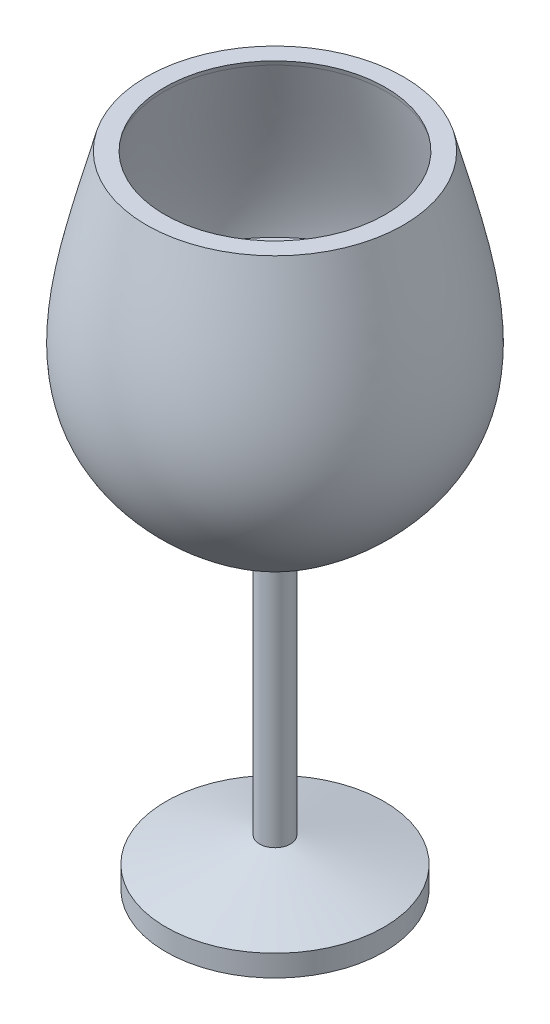
ISO-10303-21;
HEADER;
FILE_DESCRIPTION(('STEP AP214'),'2;1');
FILE_NAME('part.step','',(''),(''),'','','');
FILE_SCHEMA(('AUTOMOTIVE_DESIGN { 1 0 10303 214 1 1 1 1 }'));
ENDSEC;
DATA;
#1=APPLICATION_CONTEXT('core data for automotive mechanical design processes');
#2=APPLICATION_PROTOCOL_DEFINITION('international standard','automotive_design',2000,#1);
#3=PRODUCT_CONTEXT('',#1,'mechanical');
#4=PRODUCT('Part','Part','',(#3));
#5=PRODUCT_RELATED_PRODUCT_CATEGORY('part','',(#4));
#6=PRODUCT_DEFINITION_FORMATION('','',#4);
#7=PRODUCT_DEFINITION_CONTEXT('part definition',#1,'design');
#8=PRODUCT_DEFINITION('design','',#6,#7);
#9=PRODUCT_DEFINITION_SHAPE('','',#8);
#10=(LENGTH_UNIT() NAMED_UNIT(*) SI_UNIT(.MILLI.,.METRE.));
#11=(NAMED_UNIT(*) PLANE_ANGLE_UNIT() SI_UNIT($,.RADIAN.));
#12=(NAMED_UNIT(*) SI_UNIT($,.STERADIAN.) SOLID_ANGLE_UNIT());
#13=UNCERTAINTY_MEASURE_WITH_UNIT(LENGTH_MEASURE(1.E-05),#10,'distance_accuracy_value','');
#14=(GEOMETRIC_REPRESENTATION_CONTEXT(3) GLOBAL_UNCERTAINTY_ASSIGNED_CONTEXT((#13)) GLOBAL_UNIT_ASSIGNED_CONTEXT((#10,
#11,#12)) REPRESENTATION_CONTEXT('',''));
#15=CARTESIAN_POINT('',(0.,0.,0.));
#16=DIRECTION('',(0.,0.,1.));
#17=DIRECTION('',(1.,0.,0.));
#18=AXIS2_PLACEMENT_3D('',#15,#16,#17);
#19=CARTESIAN_POINT('',(18.0204745204967,9.7380344340659,0.));
#20=CARTESIAN_POINT('',(13.2322713075339,4.62684453920163,0.));
#21=CARTESIAN_POINT('',(6.78649593657619,2.17173837301164,0.));
#22=CARTESIAN_POINT('',(0.,2.1717398389887,0.));
#23=B_SPLINE_CURVE_WITH_KNOTS('',3,(#19,#20,#21,#22),.UNSPECIFIED.,.F.,.F.,(4,4),(0.,1.),.UNSPECIFIED.);
#24=CARTESIAN_POINT('',(0.,24.4330712107274,0.));
#25=DIRECTION('',(0.,1.,0.));
#26=AXIS1_PLACEMENT('',#24,#25);
#27=SURFACE_OF_REVOLUTION('',#23,#26);
#28=CARTESIAN_POINT('',(0.,2.17173983898873,0.));
#29=VERTEX_POINT('',#28);
#30=VERTEX_LOOP('',#29);
#31=FACE_BOUND('',#30,.T.);
#32=CARTESIAN_POINT('',(0.,9.73803443406594,0.));
#33=DIRECTION('',(0.,1.,0.));
#34=DIRECTION('',(-1.,0.,0.));
#35=AXIS2_PLACEMENT_3D('',#32,#33,#34);
#36=CIRCLE('',#35,18.0204745204966);
#37=CARTESIAN_POINT('',(-18.0204745204965,9.73803443406597,0.));
#38=VERTEX_POINT('',#37);
#39=EDGE_CURVE('E12',#38,#38,#36,.T.);
#40=ORIENTED_EDGE('',*,*,#39,.F.);
#41=EDGE_LOOP('',(#40));
#42=FACE_BOUND('',#41,.T.);
#43=ADVANCED_FACE('F49',(#31,#42),#27,.F.);
#44=CARTESIAN_POINT('',(18.0204745204966,9.7380344340659,0.));
#45=CARTESIAN_POINT('',(18.4900685089358,10.239614320576,0.));
#46=CARTESIAN_POINT('',(19.4924558868256,11.3813893940339,0.));
#47=CARTESIAN_POINT('',(21.9691341755332,14.7112040778336,0.));
#48=CARTESIAN_POINT('',(24.3918502599429,20.2138998027823,0.));
#49=CARTESIAN_POINT('',(24.772115373663,28.2858788496949,0.));
#50=CARTESIAN_POINT('',(23.4228134455826,36.6928847973291,0.));
#51=CARTESIAN_POINT('',(21.3279127638743,45.1712420028273,0.));
#52=CARTESIAN_POINT('',(19.7768163109431,50.8992505758036,0.));
#53=CARTESIAN_POINT('',(19.018524325718,53.7532378800779,0.));
#54=B_SPLINE_CURVE_WITH_KNOTS('',3,(#44,#45,#46,#47,#48,#49,#50,#51,#52,#53),.UNSPECIFIED.,.F.,
.F.,(4,1,1,1,1,1,1,4),(0.,0.0455936969122257,0.101438668485243,0.281150934788194,
0.460863201091146,0.640575467394097,0.820287733697049,1.),.UNSPECIFIED.);
#55=CARTESIAN_POINT('',(0.,24.4330712107274,0.));
#56=DIRECTION('',(0.,1.,0.));
#57=AXIS1_PLACEMENT('',#55,#56);
#58=SURFACE_OF_REVOLUTION('',#54,#57);
#59=CARTESIAN_POINT('',(0.,24.4330712107275,0.));
#60=DIRECTION('',(0.,1.,0.));
#61=DIRECTION('',(-1.,0.,0.));
#62=AXIS2_PLACEMENT_3D('',#59,#60,#61);
#63=CIRCLE('',#62,24.4979032601242);
#64=CARTESIAN_POINT('',(-24.4979032601241,24.4330712107275,0.));
#65=VERTEX_POINT('',#64);
#66=EDGE_CURVE('E56',#65,#65,#63,.T.);
#67=ORIENTED_EDGE('',*,*,#66,.F.);
#68=EDGE_LOOP('',(#67));
#69=FACE_BOUND('',#68,.T.);
#70=ORIENTED_EDGE('',*,*,#39,.T.);
#71=EDGE_LOOP('',(#70));
#72=FACE_BOUND('',#71,.T.);
#73=ADVANCED_FACE('F61',(#69,#72),#58,.T.);
#74=CARTESIAN_POINT('',(0.,24.4330712107274,0.));
#75=DIRECTION('',(0.,1.,0.));
#76=DIRECTION('',(-1.,0.,0.));
#77=AXIS2_PLACEMENT_3D('',#74,#75,#76);
#78=PLANE('',#77);
#79=ORIENTED_EDGE('',*,*,#66,.T.);
#80=EDGE_LOOP('',(#79));
#81=FACE_BOUND('',#80,.T.);
#82=ADVANCED_FACE('F65',(#81),#78,.T.);
#83=CLOSED_SHELL('',(#43,#73,#82));
#84=MANIFOLD_SOLID_BREP('B2_NOT_SHOWN',#83);
#85=CARTESIAN_POINT('',(0.,54.5235970310579,0.));
#86=DIRECTION('',(0.,1.,0.));
#87=DIRECTION('',(-1.,0.,0.));
#88=AXIS2_PLACEMENT_3D('',#85,#86,#87);
#89=PLANE('',#88);
#90=CARTESIAN_POINT('',(0.,54.5235970310579,0.));
#91=DIRECTION('',(0.,-1.,0.));
#92=DIRECTION('',(1.,0.,0.));
#93=AXIS2_PLACEMENT_3D('',#90,#91,#92);
#94=CIRCLE('',#93,18.8138432575654);
#95=CARTESIAN_POINT('',(18.8138432575654,54.5235970310579,0.));
#96=VERTEX_POINT('',#95);
#97=EDGE_CURVE('E132',#96,#96,#94,.T.);
#98=ORIENTED_EDGE('',*,*,#97,.T.);
#99=EDGE_LOOP('',(#98));
#100=FACE_BOUND('',#99,.T.);
#101=CARTESIAN_POINT('',(0.,54.5235970310579,0.));
#102=DIRECTION('',(0.,-1.,0.));
#103=DIRECTION('',(1.,0.,0.));
#104=AXIS2_PLACEMENT_3D('',#101,#102,#103);
#105=CIRCLE('',#104,21.917928881571);
#106=CARTESIAN_POINT('',(21.917928881571,54.5235970310579,0.));
#107=VERTEX_POINT('',#106);
#108=EDGE_CURVE('E112',#107,#107,#105,.T.);
#109=ORIENTED_EDGE('',*,*,#108,.F.);
#110=EDGE_LOOP('',(#109));
#111=FACE_BOUND('',#110,.T.);
#112=ADVANCED_FACE('F105',(#100,#111),#89,.T.);
#113=CARTESIAN_POINT('',(2.63125382269372,-4.73625688084869,0.));
#114=CARTESIAN_POINT('',(34.4711174987146,12.0189705292343,0.));
#115=CARTESIAN_POINT('',(29.4430535157966,26.1937160551501,0.));
#116=CARTESIAN_POINT('',(21.917928881571,54.5235970310579,0.));
#117=B_SPLINE_CURVE_WITH_KNOTS('',3,(#113,#114,#115,#116),.UNSPECIFIED.,.F.,.F.,(4,4),(0.,1.),.UNSPECIFIED.);
#118=CARTESIAN_POINT('',(0.,-54.5235970310579,0.));
#119=DIRECTION('',(0.,-1.,0.));
#120=AXIS1_PLACEMENT('',#118,#119);
#121=SURFACE_OF_REVOLUTION('',#117,#120);
#122=ORIENTED_EDGE('',*,*,#108,.T.);
#123=EDGE_LOOP('',(#122));
#124=FACE_BOUND('',#123,.T.);
#125=CARTESIAN_POINT('',(0.,-4.73625688084869,0.));
#126=DIRECTION('',(0.,-1.,0.));
#127=DIRECTION('',(1.,0.,0.));
#128=AXIS2_PLACEMENT_3D('',#125,#126,#127);
#129=CIRCLE('',#128,2.63125382269371);
#130=CARTESIAN_POINT('',(2.63125382269372,-4.73625688084869,0.));
#131=VERTEX_POINT('',#130);
#132=EDGE_CURVE('E47',#131,#131,#129,.T.);
#133=ORIENTED_EDGE('',*,*,#132,.F.);
#134=EDGE_LOOP('',(#133));
#135=FACE_BOUND('',#134,.T.);
#136=ADVANCED_FACE('F143',(#124,#135),#121,.F.);
#137=CARTESIAN_POINT('',(0.,-50.8616839762071,0.));
#138=DIRECTION('',(0.,-1.,0.));
#139=DIRECTION('',(1.,0.,0.));
#140=AXIS2_PLACEMENT_3D('',#137,#138,#139);
#141=CONICAL_SURFACE('',#140,18.5948712159354,1.30772398914342);
#142=CARTESIAN_POINT('',(0.,-46.562458286038,0.));
#143=DIRECTION('',(0.,-1.,0.));
#144=DIRECTION('',(1.,0.,0.));
#145=AXIS2_PLACEMENT_3D('',#142,#143,#144);
#146=CIRCLE('',#145,2.6312538226937);
#147=CARTESIAN_POINT('',(2.63125382269371,-46.562458286038,0.));
#148=VERTEX_POINT('',#147);
#149=EDGE_CURVE('E125',#148,#148,#146,.T.);
#150=CARTESIAN_POINT('',(0.,-50.8616839762071,0.));
#151=DIRECTION('',(0.,-1.,0.));
#152=DIRECTION('',(1.,0.,0.));
#153=AXIS2_PLACEMENT_3D('',#150,#151,#152);
#154=CIRCLE('',#153,18.5948712159354);
#155=CARTESIAN_POINT('',(18.5948712159354,-50.8616839762071,0.));
#156=VERTEX_POINT('',#155);
#157=EDGE_CURVE('E129',#156,#156,#154,.T.);
#158=CARTESIAN_POINT('',(2.63125382269371,-46.562458286038,0.));
#159=CARTESIAN_POINT('',(2.79754150387332,-46.6072418869773,0.));
#160=CARTESIAN_POINT('',(2.96382918505292,-46.6520254879166,0.));
#161=CARTESIAN_POINT('',(3.29640454741212,-46.7415926897951,0.));
#162=CARTESIAN_POINT('',(3.46269222859172,-46.7863762907343,0.));
#163=CARTESIAN_POINT('',(3.79526759095092,-46.8759434926129,0.));
#164=CARTESIAN_POINT('',(3.96155527213052,-46.9207270935521,0.));
#165=CARTESIAN_POINT('',(4.29413063448972,-47.0102942954306,0.));
#166=CARTESIAN_POINT('',(4.46041831566932,-47.0550778963699,0.));
#167=CARTESIAN_POINT('',(4.79299367802853,-47.1446450982484,0.));
#168=CARTESIAN_POINT('',(4.95928135920813,-47.1894286991877,0.));
#169=CARTESIAN_POINT('',(5.29185672156733,-47.2789959010662,0.));
#170=CARTESIAN_POINT('',(5.45814440274693,-47.3237795020055,0.));
#171=CARTESIAN_POINT('',(5.79071976510613,-47.413346703884,0.));
#172=CARTESIAN_POINT('',(5.95700744628573,-47.4581303048232,0.));
#173=CARTESIAN_POINT('',(6.28958280864494,-47.5476975067018,0.));
#174=CARTESIAN_POINT('',(6.45587048982453,-47.592481107641,0.));
#175=CARTESIAN_POINT('',(6.78844585218374,-47.6820483095196,0.));
#176=CARTESIAN_POINT('',(6.95473353336334,-47.7268319104588,0.));
#177=CARTESIAN_POINT('',(7.28730889572254,-47.8163991123373,0.));
#178=CARTESIAN_POINT('',(7.45359657690214,-47.8611827132766,0.));
#179=CARTESIAN_POINT('',(7.78617193926134,-47.9507499151551,0.));
#180=CARTESIAN_POINT('',(7.95245962044095,-47.9955335160944,0.));
#181=CARTESIAN_POINT('',(8.28503498280015,-48.0851007179729,0.));
#182=CARTESIAN_POINT('',(8.45132266397975,-48.1298843189122,0.));
#183=CARTESIAN_POINT('',(8.78389802633895,-48.2194515207907,0.));
#184=CARTESIAN_POINT('',(8.95018570751855,-48.2642351217299,0.));
#185=CARTESIAN_POINT('',(9.28276106987775,-48.3538023236085,0.));
#186=CARTESIAN_POINT('',(9.44904875105735,-48.3985859245477,0.));
#187=CARTESIAN_POINT('',(9.78162411341656,-48.4881531264263,0.));
#188=CARTESIAN_POINT('',(9.94791179459616,-48.5329367273655,0.));
#189=CARTESIAN_POINT('',(10.2804871569554,-48.622503929244,0.));
#190=CARTESIAN_POINT('',(10.446774838135,-48.6672875301833,0.));
#191=CARTESIAN_POINT('',(10.7793502004942,-48.7568547320618,0.));
#192=CARTESIAN_POINT('',(10.9456378816738,-48.8016383330011,0.));
#193=CARTESIAN_POINT('',(11.278213244033,-48.8912055348796,0.));
#194=CARTESIAN_POINT('',(11.4445009252126,-48.9359891358189,0.));
#195=CARTESIAN_POINT('',(11.7770762875718,-49.0255563376974,0.));
#196=CARTESIAN_POINT('',(11.9433639687514,-49.0703399386366,0.));
#197=CARTESIAN_POINT('',(12.2759393311106,-49.1599071405152,0.));
#198=CARTESIAN_POINT('',(12.4422270122902,-49.2046907414544,0.));
#199=CARTESIAN_POINT('',(12.7748023746494,-49.294257943333,0.));
#200=CARTESIAN_POINT('',(12.941090055829,-49.3390415442722,0.));
#201=CARTESIAN_POINT('',(13.2736654181882,-49.4286087461507,0.));
#202=CARTESIAN_POINT('',(13.4399530993678,-49.47339234709,0.));
#203=CARTESIAN_POINT('',(13.772528461727,-49.5629595489685,0.));
#204=CARTESIAN_POINT('',(13.9388161429066,-49.6077431499078,0.));
#205=CARTESIAN_POINT('',(14.2713915052658,-49.6973103517863,0.));
#206=CARTESIAN_POINT('',(14.4376791864454,-49.7420939527256,0.));
#207=CARTESIAN_POINT('',(14.7702545488046,-49.8316611546041,0.));
#208=CARTESIAN_POINT('',(14.9365422299842,-49.8764447555433,0.));
#209=CARTESIAN_POINT('',(15.2691175923434,-49.9660119574219,0.));
#210=CARTESIAN_POINT('',(15.435405273523,-50.0107955583611,0.));
#211=CARTESIAN_POINT('',(15.7679806358822,-50.1003627602397,0.));
#212=CARTESIAN_POINT('',(15.9342683170618,-50.1451463611789,0.));
#213=CARTESIAN_POINT('',(16.266843679421,-50.2347135630574,0.));
#214=CARTESIAN_POINT('',(16.4331313606006,-50.2794971639967,0.));
#215=CARTESIAN_POINT('',(16.7657067229598,-50.3690643658752,0.));
#216=CARTESIAN_POINT('',(16.9319944041394,-50.4138479668145,0.));
#217=CARTESIAN_POINT('',(17.2645697664986,-50.503415168693,0.));
#218=CARTESIAN_POINT('',(17.4308574476782,-50.5481987696323,0.));
#219=CARTESIAN_POINT('',(17.7634328100374,-50.6377659715108,0.));
#220=CARTESIAN_POINT('',(17.929720491217,-50.68254957245,0.));
#221=CARTESIAN_POINT('',(18.2622958535762,-50.7721167743286,0.));
#222=CARTESIAN_POINT('',(18.4285835347558,-50.8169003752678,0.));
#223=CARTESIAN_POINT('',(18.5948712159354,-50.8616839762071,0.));
#224=B_SPLINE_CURVE_WITH_KNOTS('',3,(#158,#159,#160,#161,#162,#163,#164,#165,#166,#167,#168,
#169,#170,#171,#172,#173,#174,#175,#176,#177,#178,#179,#180,#181,#182,#183,#184,#185,#186,#187,
#188,#189,#190,#191,#192,#193,#194,#195,#196,#197,#198,#199,#200,#201,#202,#203,#204,#205,#206,
#207,#208,#209,#210,#211,#212,#213,#214,#215,#216,#217,#218,#219,#220,#221,#222,#223),
.UNSPECIFIED.,.F.,.F.,(4,2,2,2,2,2,2,2,2,2,2,2,2,2,2,2,2,2,2,2,2,2,2,2,2,2,2,2,2,2,2,2,4),(0.,
0.516637662609474,1.03327532521895,1.54991298782842,2.0665506504379,2.58318831304737,
3.09982597565684,3.61646363826631,4.13310130087579,4.64973896348526,5.16637662609474,
5.68301428870421,6.19965195131368,6.71628961392316,7.23292727653263,7.7495649391421,
8.26620260175158,8.78284026436105,9.29947792697053,9.81611558958,10.3327532521895,
10.8493909147989,11.3660285774084,11.8826662400179,12.3993039026274,12.9159415652368,
13.4325792278463,13.9492168904558,14.4658545530653,14.9824922156747,15.4991298782842,
16.0157675408937,16.5324052035032),.UNSPECIFIED.);
#225=EDGE_CURVE('BSEAM146',#148,#156,#224,.T.);
#226=ORIENTED_EDGE('',*,*,#149,.T.);
#227=ORIENTED_EDGE('',*,*,#157,.F.);
#228=ORIENTED_EDGE('',*,*,#225,.T.);
#229=ORIENTED_EDGE('',*,*,#225,.F.);
#230=EDGE_LOOP('',(#226,#228,#227,#229));
#231=FACE_BOUND('',#230,.T.);
#232=ADVANCED_FACE('F146',(#231),#141,.T.);
#233=CARTESIAN_POINT('',(0.,-54.5235970310579,0.));
#234=DIRECTION('',(0.,-1.,0.));
#235=DIRECTION('',(1.,0.,0.));
#236=AXIS2_PLACEMENT_3D('',#233,#234,#235);
#237=CYLINDRICAL_SURFACE('',#236,18.5948712159354);
#238=ORIENTED_EDGE('',*,*,#157,.T.);
#239=EDGE_LOOP('',(#238));
#240=FACE_BOUND('',#239,.T.);
#241=CARTESIAN_POINT('',(0.,-54.5235970310579,0.));
#242=DIRECTION('',(0.,-1.,0.));
#243=DIRECTION('',(1.,0.,0.));
#244=AXIS2_PLACEMENT_3D('',#241,#242,#243);
#245=CIRCLE('',#244,18.5948712159354);
#246=CARTESIAN_POINT('',(18.5948712159354,-54.5235970310579,0.));
#247=VERTEX_POINT('',#246);
#248=EDGE_CURVE('E269',#247,#247,#245,.T.);
#249=ORIENTED_EDGE('',*,*,#248,.F.);
#250=EDGE_LOOP('',(#249));
#251=FACE_BOUND('',#250,.T.);
#252=ADVANCED_FACE('F154',(#240,#251),#237,.T.);
#253=CARTESIAN_POINT('',(0.,-54.5235970310579,0.));
#254=DIRECTION('',(0.,-1.,0.));
#255=DIRECTION('',(1.,0.,0.));
#256=AXIS2_PLACEMENT_3D('',#253,#254,#255);
#257=CYLINDRICAL_SURFACE('',#256,2.6312538226937);
#258=ORIENTED_EDGE('',*,*,#132,.T.);
#259=EDGE_LOOP('',(#258));
#260=FACE_BOUND('',#259,.T.);
#261=ORIENTED_EDGE('',*,*,#149,.F.);
#262=EDGE_LOOP('',(#261));
#263=FACE_BOUND('',#262,.T.);
#264=ADVANCED_FACE('F107',(#260,#263),#257,.T.);
#265=CARTESIAN_POINT('',(0.,-54.5235970310579,0.));
#266=DIRECTION('',(0.,-1.,0.));
#267=DIRECTION('',(1.,0.,0.));
#268=AXIS2_PLACEMENT_3D('',#265,#266,#267);
#269=PLANE('',#268);
#270=ORIENTED_EDGE('',*,*,#248,.T.);
#271=EDGE_LOOP('',(#270));
#272=FACE_BOUND('',#271,.T.);
#273=ADVANCED_FACE('F119',(#272),#269,.T.);
#274=CARTESIAN_POINT('',(18.0410293841508,9.76000981858693,0.));
#275=CARTESIAN_POINT('',(13.2507279935608,4.63388304850354,0.));
#276=CARTESIAN_POINT('',(6.7962127503958,2.17173983898877,0.));
#277=CARTESIAN_POINT('',(0.,2.17173983898872,0.));
#278=B_SPLINE_CURVE_WITH_KNOTS('',3,(#274,#275,#276,#277),.UNSPECIFIED.,.F.,.F.,(4,4),(0.,1.),.UNSPECIFIED.);
#279=CARTESIAN_POINT('',(0.,-2.08195019282968,0.));
#280=DIRECTION('',(0.,-1.,0.));
#281=AXIS1_PLACEMENT('',#279,#280);
#282=SURFACE_OF_REVOLUTION('',#278,#281);
#283=CARTESIAN_POINT('',(0.,2.17173983898872,0.));
#284=VERTEX_POINT('',#283);
#285=VERTEX_LOOP('',#284);
#286=FACE_BOUND('',#285,.T.);
#287=CARTESIAN_POINT('',(0.,9.7380344340659,0.));
#288=DIRECTION('',(0.,-1.,0.));
#289=DIRECTION('',(1.,0.,0.));
#290=AXIS2_PLACEMENT_3D('',#287,#288,#289);
#291=CIRCLE('',#290,18.0204745204966);
#292=CARTESIAN_POINT('',(18.0204745204966,9.7380344340659,0.));
#293=VERTEX_POINT('',#292);
#294=EDGE_CURVE('E123',#293,#293,#291,.T.);
#295=ORIENTED_EDGE('',*,*,#294,.F.);
#296=EDGE_LOOP('',(#295));
#297=FACE_BOUND('',#296,.T.);
#298=ADVANCED_FACE('F115',(#286,#297),#282,.F.);
#299=CARTESIAN_POINT('',(1.23316369472001,-2.08195019282968,0.));
#300=CARTESIAN_POINT('',(2.50865179455628,-1.41011851310019,0.));
#301=CARTESIAN_POINT('',(5.04504117979889,-0.0211804316823236,0.));
#302=CARTESIAN_POINT('',(9.79053170164773,2.85311600755581,0.));
#303=CARTESIAN_POINT('',(13.6686429512201,5.64158783760901,0.));
#304=CARTESIAN_POINT('',(17.1295804941064,8.76036442411872,0.));
#305=CARTESIAN_POINT('',(19.1025449839092,10.8571666656221,0.));
#306=CARTESIAN_POINT('',(21.9691341755332,14.7112040778336,0.));
#307=CARTESIAN_POINT('',(24.3918502599429,20.2138998027823,0.));
#308=CARTESIAN_POINT('',(24.772115373663,28.2858788496949,0.));
#309=CARTESIAN_POINT('',(23.4228134455826,36.6928847973291,0.));
#310=CARTESIAN_POINT('',(21.3279127638743,45.1712420028273,0.));
#311=CARTESIAN_POINT('',(19.7768163109431,50.8992505758036,0.));
#312=CARTESIAN_POINT('',(19.018524325718,53.7532378800779,0.));
#313=B_SPLINE_CURVE_WITH_KNOTS('',3,(#299,#300,#301,#302,#303,#304,#305,#306,#307,#308,#309,
#310,#311,#312),.UNSPECIFIED.,.F.,.F.,(4,1,1,1,1,1,1,1,1,1,1,4),(0.,0.0625,0.125,
0.242406677892763,0.273656677892763,0.336156677892763,0.375,0.5,0.625,0.75,0.875,1.),.UNSPECIFIED.);
#314=CARTESIAN_POINT('',(0.,-2.08195019282968,0.));
#315=DIRECTION('',(0.,-1.,0.));
#316=AXIS1_PLACEMENT('',#314,#315);
#317=SURFACE_OF_REVOLUTION('',#313,#316);
#318=CARTESIAN_POINT('',(0.,53.7532378800779,0.));
#319=DIRECTION('',(0.,-1.,0.));
#320=DIRECTION('',(1.,0.,0.));
#321=AXIS2_PLACEMENT_3D('',#318,#319,#320);
#322=CIRCLE('',#321,19.018524325718);
#323=CARTESIAN_POINT('',(19.018524325718,53.7532378800779,0.));
#324=VERTEX_POINT('',#323);
#325=EDGE_CURVE('E126',#324,#324,#322,.T.);
#326=ORIENTED_EDGE('',*,*,#325,.F.);
#327=EDGE_LOOP('',(#326));
#328=FACE_BOUND('',#327,.T.);
#329=ORIENTED_EDGE('',*,*,#294,.T.);
#330=EDGE_LOOP('',(#329));
#331=FACE_BOUND('',#330,.T.);
#332=ADVANCED_FACE('F118',(#328,#331),#317,.T.);
#333=CARTESIAN_POINT('',(0.,54.5235970310579,0.));
#334=DIRECTION('',(0.,-1.,0.));
#335=DIRECTION('',(1.,0.,0.));
#336=AXIS2_PLACEMENT_3D('',#333,#334,#335);
#337=CONICAL_SURFACE('',#336,18.8138432575654,0.259695613226624);
#338=ORIENTED_EDGE('',*,*,#325,.T.);
#339=EDGE_LOOP('',(#338));
#340=FACE_BOUND('',#339,.T.);
#341=ORIENTED_EDGE('',*,*,#97,.F.);
#342=EDGE_LOOP('',(#341));
#343=FACE_BOUND('',#342,.T.);
#344=ADVANCED_FACE('F180',(#340,#343),#337,.F.);
#345=CLOSED_SHELL('',(#112,#136,#232,#252,#264,#273,#298,#332,#344));
#346=MANIFOLD_SOLID_BREP('B6',#345);
#347=ADVANCED_BREP_SHAPE_REPRESENTATION('',(#18,#84,#346),#14);
#348=SHAPE_DEFINITION_REPRESENTATION(#9,#347);
ENDSEC;
END-ISO-10303-21;
